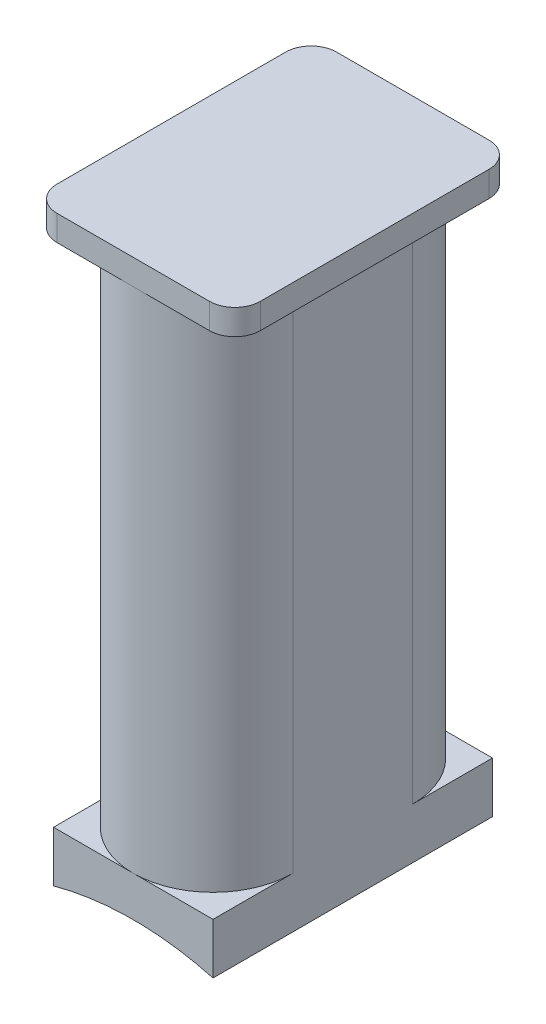
ISO-10303-21;
HEADER;
FILE_DESCRIPTION(('STEP AP214'),'2;1');
FILE_NAME('part.step','',(''),(''),'','','');
FILE_SCHEMA(('AUTOMOTIVE_DESIGN { 1 0 10303 214 1 1 1 1 }'));
ENDSEC;
DATA;
#1=APPLICATION_CONTEXT('core data for automotive mechanical design processes');
#2=APPLICATION_PROTOCOL_DEFINITION('international standard','automotive_design',2000,#1);
#3=PRODUCT_CONTEXT('',#1,'mechanical');
#4=PRODUCT('Part','Part','',(#3));
#5=PRODUCT_RELATED_PRODUCT_CATEGORY('part','',(#4));
#6=PRODUCT_DEFINITION_FORMATION('','',#4);
#7=PRODUCT_DEFINITION_CONTEXT('part definition',#1,'design');
#8=PRODUCT_DEFINITION('design','',#6,#7);
#9=PRODUCT_DEFINITION_SHAPE('','',#8);
#10=(LENGTH_UNIT() NAMED_UNIT(*) SI_UNIT(.MILLI.,.METRE.));
#11=(NAMED_UNIT(*) PLANE_ANGLE_UNIT() SI_UNIT($,.RADIAN.));
#12=(NAMED_UNIT(*) SI_UNIT($,.STERADIAN.) SOLID_ANGLE_UNIT());
#13=UNCERTAINTY_MEASURE_WITH_UNIT(LENGTH_MEASURE(1.E-05),#10,'distance_accuracy_value','');
#14=(GEOMETRIC_REPRESENTATION_CONTEXT(3) GLOBAL_UNCERTAINTY_ASSIGNED_CONTEXT((#13)) GLOBAL_UNIT_ASSIGNED_CONTEXT((#10,
#11,#12)) REPRESENTATION_CONTEXT('',''));
#15=CARTESIAN_POINT('',(0.,0.,0.));
#16=DIRECTION('',(0.,0.,1.));
#17=DIRECTION('',(1.,0.,0.));
#18=AXIS2_PLACEMENT_3D('',#15,#16,#17);
#19=CARTESIAN_POINT('',(174.255949813369,165.455600212496,5.5));
#20=DIRECTION('',(0.,0.,-1.));
#21=DIRECTION('',(-1.,0.,0.));
#22=AXIS2_PLACEMENT_3D('',#19,#20,#21);
#23=PLANE('',#22);
#24=DIRECTION('',(0.,1.,0.));
#25=VECTOR('',#24,1.);
#26=CARTESIAN_POINT('',(172.755949813369,165.455600212496,5.5));
#27=LINE('',#26,#25);
#28=CARTESIAN_POINT('',(172.755949813369,164.955600212496,5.5));
#29=VERTEX_POINT('',#28);
#30=CARTESIAN_POINT('',(172.755949813369,165.455600212496,5.5));
#31=VERTEX_POINT('',#30);
#32=EDGE_CURVE('E142',#29,#31,#27,.T.);
#33=ORIENTED_EDGE('',*,*,#32,.F.);
#34=DIRECTION('',(-1.,0.,0.));
#35=VECTOR('',#34,1.);
#36=CARTESIAN_POINT('',(174.255949813369,164.955600212496,5.5));
#37=LINE('',#36,#35);
#38=CARTESIAN_POINT('',(174.255949813369,164.955600212496,5.5));
#39=VERTEX_POINT('',#38);
#40=EDGE_CURVE('E248',#39,#29,#37,.T.);
#41=ORIENTED_EDGE('',*,*,#40,.F.);
#42=DIRECTION('',(-1.,0.,0.));
#43=VECTOR('',#42,1.);
#44=CARTESIAN_POINT('',(174.255949813369,164.955600212496,5.5));
#45=LINE('',#44,#43);
#46=CARTESIAN_POINT('',(175.755949813369,164.955600212496,5.5));
#47=VERTEX_POINT('',#46);
#48=EDGE_CURVE('E251',#47,#39,#45,.T.);
#49=ORIENTED_EDGE('',*,*,#48,.F.);
#50=DIRECTION('',(0.,1.,0.));
#51=VECTOR('',#50,1.);
#52=CARTESIAN_POINT('',(175.755949813369,165.455600212496,5.5));
#53=LINE('',#52,#51);
#54=CARTESIAN_POINT('',(175.755949813369,165.455600212496,5.5));
#55=VERTEX_POINT('',#54);
#56=EDGE_CURVE('E249',#55,#47,#53,.F.);
#57=ORIENTED_EDGE('',*,*,#56,.F.);
#58=DIRECTION('',(1.,0.,0.));
#59=VECTOR('',#58,1.);
#60=CARTESIAN_POINT('',(0.,165.455600212496,5.5));
#61=LINE('',#60,#59);
#62=EDGE_CURVE('E146',#31,#55,#61,.T.);
#63=ORIENTED_EDGE('',*,*,#62,.F.);
#64=EDGE_LOOP('',(#33,#41,#49,#57,#63));
#65=FACE_BOUND('',#64,.T.);
#66=ADVANCED_FACE('F17',(#65),#23,.F.);
#67=CARTESIAN_POINT('',(174.255949813369,165.455600212496,0.));
#68=DIRECTION('',(0.,0.,1.));
#69=DIRECTION('',(1.,0.,0.));
#70=AXIS2_PLACEMENT_3D('',#67,#68,#69);
#71=PLANE('',#70);
#72=DIRECTION('',(0.,1.,0.));
#73=VECTOR('',#72,1.);
#74=CARTESIAN_POINT('',(172.755949813369,165.455600212496,0.));
#75=LINE('',#74,#73);
#76=CARTESIAN_POINT('',(172.755949813369,165.455600212496,0.));
#77=VERTEX_POINT('',#76);
#78=CARTESIAN_POINT('',(172.755949813369,164.955600212496,0.));
#79=VERTEX_POINT('',#78);
#80=EDGE_CURVE('E244',#77,#79,#75,.F.);
#81=ORIENTED_EDGE('',*,*,#80,.F.);
#82=DIRECTION('',(1.,0.,0.));
#83=VECTOR('',#82,1.);
#84=CARTESIAN_POINT('',(0.,165.455600212496,0.));
#85=LINE('',#84,#83);
#86=CARTESIAN_POINT('',(175.755949813369,165.455600212496,0.));
#87=VERTEX_POINT('',#86);
#88=EDGE_CURVE('E229',#87,#77,#85,.F.);
#89=ORIENTED_EDGE('',*,*,#88,.F.);
#90=DIRECTION('',(0.,1.,0.));
#91=VECTOR('',#90,1.);
#92=CARTESIAN_POINT('',(175.755949813369,165.455600212496,0.));
#93=LINE('',#92,#91);
#94=CARTESIAN_POINT('',(175.755949813369,164.955600212496,0.));
#95=VERTEX_POINT('',#94);
#96=EDGE_CURVE('E242',#95,#87,#93,.T.);
#97=ORIENTED_EDGE('',*,*,#96,.F.);
#98=DIRECTION('',(1.,0.,0.));
#99=VECTOR('',#98,1.);
#100=CARTESIAN_POINT('',(174.255949813369,164.955600212496,0.));
#101=LINE('',#100,#99);
#102=CARTESIAN_POINT('',(174.255949813369,164.955600212496,0.));
#103=VERTEX_POINT('',#102);
#104=EDGE_CURVE('E245',#103,#95,#101,.T.);
#105=ORIENTED_EDGE('',*,*,#104,.F.);
#106=DIRECTION('',(1.,0.,0.));
#107=VECTOR('',#106,1.);
#108=CARTESIAN_POINT('',(174.255949813369,164.955600212496,0.));
#109=LINE('',#108,#107);
#110=EDGE_CURVE('E147',#79,#103,#109,.T.);
#111=ORIENTED_EDGE('',*,*,#110,.F.);
#112=EDGE_LOOP('',(#81,#89,#97,#105,#111));
#113=FACE_BOUND('',#112,.T.);
#114=ADVANCED_FACE('F379',(#113),#71,.F.);
#115=CARTESIAN_POINT('',(0.,165.455600212496,0.));
#116=DIRECTION('',(0.,1.,0.));
#117=DIRECTION('',(0.,0.,1.));
#118=AXIS2_PLACEMENT_3D('',#115,#116,#117);
#119=PLANE('',#118);
#120=ORIENTED_EDGE('',*,*,#88,.T.);
#121=CARTESIAN_POINT('',(172.755949813369,165.455600212496,0.5));
#122=DIRECTION('',(0.,1.,0.));
#123=DIRECTION('',(0.,0.,1.));
#124=AXIS2_PLACEMENT_3D('',#121,#122,#123);
#125=CIRCLE('',#124,0.5);
#126=CARTESIAN_POINT('',(172.255949813369,165.455600212496,0.5));
#127=VERTEX_POINT('',#126);
#128=EDGE_CURVE('E153',#127,#77,#125,.F.);
#129=ORIENTED_EDGE('',*,*,#128,.F.);
#130=DIRECTION('',(0.,0.,-1.));
#131=VECTOR('',#130,1.);
#132=CARTESIAN_POINT('',(172.255949813369,165.455600212496,0.));
#133=LINE('',#132,#131);
#134=CARTESIAN_POINT('',(172.255949813369,165.455600212496,5.));
#135=VERTEX_POINT('',#134);
#136=EDGE_CURVE('E149',#127,#135,#133,.F.);
#137=ORIENTED_EDGE('',*,*,#136,.T.);
#138=CARTESIAN_POINT('',(172.755949813369,165.455600212496,5.));
#139=DIRECTION('',(0.,1.,0.));
#140=DIRECTION('',(0.,0.,1.));
#141=AXIS2_PLACEMENT_3D('',#138,#139,#140);
#142=CIRCLE('',#141,0.5);
#143=EDGE_CURVE('E20',#135,#31,#142,.T.);
#144=ORIENTED_EDGE('',*,*,#143,.T.);
#145=ORIENTED_EDGE('',*,*,#62,.T.);
#146=CARTESIAN_POINT('',(175.755949813369,165.455600212496,5.));
#147=DIRECTION('',(0.,1.,0.));
#148=DIRECTION('',(0.,0.,1.));
#149=AXIS2_PLACEMENT_3D('',#146,#147,#148);
#150=CIRCLE('',#149,0.5);
#151=CARTESIAN_POINT('',(176.255949813369,165.455600212496,5.));
#152=VERTEX_POINT('',#151);
#153=EDGE_CURVE('E180',#152,#55,#150,.F.);
#154=ORIENTED_EDGE('',*,*,#153,.F.);
#155=DIRECTION('',(0.,0.,1.));
#156=VECTOR('',#155,1.);
#157=CARTESIAN_POINT('',(176.255949813369,165.455600212496,5.5));
#158=LINE('',#157,#156);
#159=CARTESIAN_POINT('',(176.255949813369,165.455600212496,0.5));
#160=VERTEX_POINT('',#159);
#161=EDGE_CURVE('E179',#152,#160,#158,.F.);
#162=ORIENTED_EDGE('',*,*,#161,.T.);
#163=CARTESIAN_POINT('',(175.755949813369,165.455600212496,0.5));
#164=DIRECTION('',(0.,1.,0.));
#165=DIRECTION('',(0.,0.,1.));
#166=AXIS2_PLACEMENT_3D('',#163,#164,#165);
#167=CIRCLE('',#166,0.5);
#168=EDGE_CURVE('E175',#87,#160,#167,.F.);
#169=ORIENTED_EDGE('',*,*,#168,.F.);
#170=EDGE_LOOP('',(#120,#129,#137,#144,#145,#154,#162,#169));
#171=FACE_BOUND('',#170,.T.);
#172=ADVANCED_FACE('F151',(#171),#119,.T.);
#173=CARTESIAN_POINT('',(174.255949813369,148.16465037676,5.5));
#174=DIRECTION('',(0.,0.,-1.));
#175=DIRECTION('',(-1.,0.,0.));
#176=AXIS2_PLACEMENT_3D('',#173,#174,#175);
#177=PLANE('',#176);
#178=DIRECTION('',(-1.,0.,0.));
#179=VECTOR('',#178,1.);
#180=CARTESIAN_POINT('',(174.255949813369,154.955600212495,5.5));
#181=LINE('',#180,#179);
#182=CARTESIAN_POINT('',(172.685949813369,154.955600212495,5.5));
#183=VERTEX_POINT('',#182);
#184=CARTESIAN_POINT('',(174.255949813369,154.955600212495,5.5));
#185=VERTEX_POINT('',#184);
#186=EDGE_CURVE('E224',#183,#185,#181,.F.);
#187=ORIENTED_EDGE('',*,*,#186,.F.);
#188=DIRECTION('',(0.,1.,0.));
#189=VECTOR('',#188,1.);
#190=CARTESIAN_POINT('',(172.685949813369,148.16465037676,5.5));
#191=LINE('',#190,#189);
#192=CARTESIAN_POINT('',(172.685949813369,153.955600212495,5.5));
#193=VERTEX_POINT('',#192);
#194=EDGE_CURVE('E221',#193,#183,#191,.T.);
#195=ORIENTED_EDGE('',*,*,#194,.F.);
#196=CARTESIAN_POINT('',(174.255949813369,148.16465037676,5.5));
#197=DIRECTION('',(0.,0.,1.));
#198=DIRECTION('',(1.,0.,0.));
#199=AXIS2_PLACEMENT_3D('',#196,#197,#198);
#200=CIRCLE('',#199,6.);
#201=CARTESIAN_POINT('',(175.825949813368,153.955600212495,5.5));
#202=VERTEX_POINT('',#201);
#203=EDGE_CURVE('E162',#193,#202,#200,.F.);
#204=ORIENTED_EDGE('',*,*,#203,.T.);
#205=DIRECTION('',(0.,1.,0.));
#206=VECTOR('',#205,1.);
#207=CARTESIAN_POINT('',(175.825949813368,148.16465037676,5.5));
#208=LINE('',#207,#206);
#209=CARTESIAN_POINT('',(175.825949813368,154.955600212495,5.5));
#210=VERTEX_POINT('',#209);
#211=EDGE_CURVE('E225',#210,#202,#208,.F.);
#212=ORIENTED_EDGE('',*,*,#211,.F.);
#213=DIRECTION('',(-1.,0.,0.));
#214=VECTOR('',#213,1.);
#215=CARTESIAN_POINT('',(174.255949813369,154.955600212495,5.5));
#216=LINE('',#215,#214);
#217=EDGE_CURVE('E211',#185,#210,#216,.F.);
#218=ORIENTED_EDGE('',*,*,#217,.F.);
#219=EDGE_LOOP('',(#187,#195,#204,#212,#218));
#220=FACE_BOUND('',#219,.T.);
#221=ADVANCED_FACE('F342',(#220),#177,.F.);
#222=CARTESIAN_POINT('',(174.255949813369,148.16465037676,0.));
#223=DIRECTION('',(0.,0.,-1.));
#224=DIRECTION('',(-1.,0.,0.));
#225=AXIS2_PLACEMENT_3D('',#222,#223,#224);
#226=PLANE('',#225);
#227=DIRECTION('',(0.,1.,0.));
#228=VECTOR('',#227,1.);
#229=CARTESIAN_POINT('',(172.685949813369,148.16465037676,0.));
#230=LINE('',#229,#228);
#231=CARTESIAN_POINT('',(172.685949813369,153.955600212495,0.));
#232=VERTEX_POINT('',#231);
#233=CARTESIAN_POINT('',(172.685949813369,154.955600212495,0.));
#234=VERTEX_POINT('',#233);
#235=EDGE_CURVE('E202',#232,#234,#230,.T.);
#236=ORIENTED_EDGE('',*,*,#235,.T.);
#237=DIRECTION('',(1.,0.,0.));
#238=VECTOR('',#237,1.);
#239=CARTESIAN_POINT('',(175.825949813368,154.955600212495,0.));
#240=LINE('',#239,#238);
#241=CARTESIAN_POINT('',(174.255949813369,154.955600212495,0.));
#242=VERTEX_POINT('',#241);
#243=EDGE_CURVE('E186',#234,#242,#240,.T.);
#244=ORIENTED_EDGE('',*,*,#243,.T.);
#245=DIRECTION('',(1.,0.,0.));
#246=VECTOR('',#245,1.);
#247=CARTESIAN_POINT('',(175.825949813368,154.955600212495,0.));
#248=LINE('',#247,#246);
#249=CARTESIAN_POINT('',(175.825949813368,154.955600212495,0.));
#250=VERTEX_POINT('',#249);
#251=EDGE_CURVE('E197',#242,#250,#248,.T.);
#252=ORIENTED_EDGE('',*,*,#251,.T.);
#253=DIRECTION('',(0.,1.,0.));
#254=VECTOR('',#253,1.);
#255=CARTESIAN_POINT('',(175.825949813368,148.16465037676,0.));
#256=LINE('',#255,#254);
#257=CARTESIAN_POINT('',(175.825949813368,153.955600212495,0.));
#258=VERTEX_POINT('',#257);
#259=EDGE_CURVE('E207',#250,#258,#256,.F.);
#260=ORIENTED_EDGE('',*,*,#259,.T.);
#261=CARTESIAN_POINT('',(174.255949813369,148.16465037676,0.));
#262=DIRECTION('',(0.,0.,1.));
#263=DIRECTION('',(1.,0.,0.));
#264=AXIS2_PLACEMENT_3D('',#261,#262,#263);
#265=CIRCLE('',#264,6.);
#266=EDGE_CURVE('E165',#258,#232,#265,.T.);
#267=ORIENTED_EDGE('',*,*,#266,.T.);
#268=EDGE_LOOP('',(#236,#244,#252,#260,#267));
#269=FACE_BOUND('',#268,.T.);
#270=ADVANCED_FACE('F321',(#269),#226,.T.);
#271=CARTESIAN_POINT('',(175.825949813368,154.955600212495,5.5));
#272=DIRECTION('',(0.,-1.,0.));
#273=DIRECTION('',(0.,0.,-1.));
#274=AXIS2_PLACEMENT_3D('',#271,#272,#273);
#275=PLANE('',#274);
#276=DIRECTION('',(0.,0.,-1.));
#277=VECTOR('',#276,1.);
#278=CARTESIAN_POINT('',(175.825949813368,154.955600212495,5.5));
#279=LINE('',#278,#277);
#280=CARTESIAN_POINT('',(175.825949813368,154.955600212495,1.57));
#281=VERTEX_POINT('',#280);
#282=EDGE_CURVE('E193',#250,#281,#279,.F.);
#283=ORIENTED_EDGE('',*,*,#282,.F.);
#284=ORIENTED_EDGE('',*,*,#251,.F.);
#285=CARTESIAN_POINT('',(174.255949813369,154.955600212495,1.57));
#286=DIRECTION('',(0.,1.,0.));
#287=DIRECTION('',(0.,0.,1.));
#288=AXIS2_PLACEMENT_3D('',#285,#286,#287);
#289=CIRCLE('',#288,1.57);
#290=EDGE_CURVE('E286',#281,#242,#289,.T.);
#291=ORIENTED_EDGE('',*,*,#290,.F.);
#292=EDGE_LOOP('',(#283,#284,#291));
#293=FACE_BOUND('',#292,.T.);
#294=ADVANCED_FACE('F331',(#293),#275,.F.);
#295=CARTESIAN_POINT('',(175.825949813368,154.955600212495,5.5));
#296=DIRECTION('',(0.,-1.,0.));
#297=DIRECTION('',(0.,0.,-1.));
#298=AXIS2_PLACEMENT_3D('',#295,#296,#297);
#299=PLANE('',#298);
#300=ORIENTED_EDGE('',*,*,#243,.F.);
#301=DIRECTION('',(0.,0.,-1.));
#302=VECTOR('',#301,1.);
#303=CARTESIAN_POINT('',(172.685949813369,154.955600212495,5.5));
#304=LINE('',#303,#302);
#305=CARTESIAN_POINT('',(172.685949813369,154.955600212495,1.57));
#306=VERTEX_POINT('',#305);
#307=EDGE_CURVE('E188',#306,#234,#304,.T.);
#308=ORIENTED_EDGE('',*,*,#307,.F.);
#309=CARTESIAN_POINT('',(174.255949813369,154.955600212495,1.57));
#310=DIRECTION('',(0.,1.,0.));
#311=DIRECTION('',(0.,0.,1.));
#312=AXIS2_PLACEMENT_3D('',#309,#310,#311);
#313=CIRCLE('',#312,1.57);
#314=EDGE_CURVE('E185',#242,#306,#313,.T.);
#315=ORIENTED_EDGE('',*,*,#314,.F.);
#316=EDGE_LOOP('',(#300,#308,#315));
#317=FACE_BOUND('',#316,.T.);
#318=ADVANCED_FACE('F324',(#317),#299,.F.);
#319=CARTESIAN_POINT('',(175.755949813369,165.455600212496,5.));
#320=DIRECTION('',(0.,1.,0.));
#321=DIRECTION('',(0.,0.,1.));
#322=AXIS2_PLACEMENT_3D('',#319,#320,#321);
#323=CYLINDRICAL_SURFACE('',#322,0.5);
#324=CARTESIAN_POINT('',(175.755949813369,164.955600212496,5.));
#325=DIRECTION('',(0.,1.,0.));
#326=DIRECTION('',(0.,0.,1.));
#327=AXIS2_PLACEMENT_3D('',#324,#325,#326);
#328=CIRCLE('',#327,0.5);
#329=CARTESIAN_POINT('',(176.255949813369,164.955600212496,5.));
#330=VERTEX_POINT('',#329);
#331=EDGE_CURVE('E279',#47,#330,#328,.T.);
#332=ORIENTED_EDGE('',*,*,#331,.T.);
#333=DIRECTION('',(0.,1.,0.));
#334=VECTOR('',#333,1.);
#335=CARTESIAN_POINT('',(176.255949813369,165.455600212496,5.));
#336=LINE('',#335,#334);
#337=EDGE_CURVE('E176',#330,#152,#336,.T.);
#338=ORIENTED_EDGE('',*,*,#337,.T.);
#339=ORIENTED_EDGE('',*,*,#153,.T.);
#340=ORIENTED_EDGE('',*,*,#56,.T.);
#341=EDGE_LOOP('',(#332,#338,#339,#340));
#342=FACE_BOUND('',#341,.T.);
#343=ADVANCED_FACE('F295',(#342),#323,.T.);
#344=CARTESIAN_POINT('',(176.255949813369,165.455600212496,5.5));
#345=DIRECTION('',(-1.,0.,0.));
#346=DIRECTION('',(0.,0.,1.));
#347=AXIS2_PLACEMENT_3D('',#344,#345,#346);
#348=PLANE('',#347);
#349=DIRECTION('',(0.,1.,0.));
#350=VECTOR('',#349,1.);
#351=CARTESIAN_POINT('',(176.255949813369,165.455600212496,0.5));
#352=LINE('',#351,#350);
#353=CARTESIAN_POINT('',(176.255949813369,164.955600212496,0.5));
#354=VERTEX_POINT('',#353);
#355=EDGE_CURVE('E172',#160,#354,#352,.F.);
#356=ORIENTED_EDGE('',*,*,#355,.F.);
#357=ORIENTED_EDGE('',*,*,#161,.F.);
#358=ORIENTED_EDGE('',*,*,#337,.F.);
#359=DIRECTION('',(0.,0.,1.));
#360=VECTOR('',#359,1.);
#361=CARTESIAN_POINT('',(176.255949813369,164.955600212496,0.));
#362=LINE('',#361,#360);
#363=EDGE_CURVE('E278',#330,#354,#362,.F.);
#364=ORIENTED_EDGE('',*,*,#363,.T.);
#365=EDGE_LOOP('',(#356,#357,#358,#364));
#366=FACE_BOUND('',#365,.T.);
#367=ADVANCED_FACE('F371',(#366),#348,.F.);
#368=CARTESIAN_POINT('',(175.755949813369,165.455600212496,0.5));
#369=DIRECTION('',(0.,1.,0.));
#370=DIRECTION('',(0.,0.,1.));
#371=AXIS2_PLACEMENT_3D('',#368,#369,#370);
#372=CYLINDRICAL_SURFACE('',#371,0.5);
#373=CARTESIAN_POINT('',(175.755949813369,164.955600212496,0.5));
#374=DIRECTION('',(0.,1.,0.));
#375=DIRECTION('',(0.,0.,1.));
#376=AXIS2_PLACEMENT_3D('',#373,#374,#375);
#377=CIRCLE('',#376,0.5);
#378=EDGE_CURVE('E275',#354,#95,#377,.T.);
#379=ORIENTED_EDGE('',*,*,#378,.T.);
#380=ORIENTED_EDGE('',*,*,#96,.T.);
#381=ORIENTED_EDGE('',*,*,#168,.T.);
#382=ORIENTED_EDGE('',*,*,#355,.T.);
#383=EDGE_LOOP('',(#379,#380,#381,#382));
#384=FACE_BOUND('',#383,.T.);
#385=ADVANCED_FACE('F373',(#384),#372,.T.);
#386=CARTESIAN_POINT('',(172.755949813369,165.455600212496,0.5));
#387=DIRECTION('',(0.,1.,0.));
#388=DIRECTION('',(0.,0.,1.));
#389=AXIS2_PLACEMENT_3D('',#386,#387,#388);
#390=CYLINDRICAL_SURFACE('',#389,0.5);
#391=CARTESIAN_POINT('',(172.755949813369,164.955600212496,0.5));
#392=DIRECTION('',(0.,1.,0.));
#393=DIRECTION('',(0.,0.,1.));
#394=AXIS2_PLACEMENT_3D('',#391,#392,#393);
#395=CIRCLE('',#394,0.5);
#396=CARTESIAN_POINT('',(172.255949813369,164.955600212496,0.5));
#397=VERTEX_POINT('',#396);
#398=EDGE_CURVE('E270',#79,#397,#395,.T.);
#399=ORIENTED_EDGE('',*,*,#398,.T.);
#400=DIRECTION('',(0.,1.,0.));
#401=VECTOR('',#400,1.);
#402=CARTESIAN_POINT('',(172.255949813369,165.455600212496,0.5));
#403=LINE('',#402,#401);
#404=EDGE_CURVE('E157',#397,#127,#403,.T.);
#405=ORIENTED_EDGE('',*,*,#404,.T.);
#406=ORIENTED_EDGE('',*,*,#128,.T.);
#407=ORIENTED_EDGE('',*,*,#80,.T.);
#408=EDGE_LOOP('',(#399,#405,#406,#407));
#409=FACE_BOUND('',#408,.T.);
#410=ADVANCED_FACE('F378',(#409),#390,.T.);
#411=CARTESIAN_POINT('',(172.255949813369,165.455600212496,0.));
#412=DIRECTION('',(1.,0.,0.));
#413=DIRECTION('',(0.,0.,-1.));
#414=AXIS2_PLACEMENT_3D('',#411,#412,#413);
#415=PLANE('',#414);
#416=DIRECTION('',(0.,1.,0.));
#417=VECTOR('',#416,1.);
#418=CARTESIAN_POINT('',(172.255949813369,165.455600212496,5.));
#419=LINE('',#418,#417);
#420=CARTESIAN_POINT('',(172.255949813369,164.955600212496,5.));
#421=VERTEX_POINT('',#420);
#422=EDGE_CURVE('E139',#135,#421,#419,.F.);
#423=ORIENTED_EDGE('',*,*,#422,.F.);
#424=ORIENTED_EDGE('',*,*,#136,.F.);
#425=ORIENTED_EDGE('',*,*,#404,.F.);
#426=DIRECTION('',(0.,0.,1.));
#427=VECTOR('',#426,1.);
#428=CARTESIAN_POINT('',(172.255949813369,164.955600212496,0.));
#429=LINE('',#428,#427);
#430=EDGE_CURVE('E161',#397,#421,#429,.T.);
#431=ORIENTED_EDGE('',*,*,#430,.T.);
#432=EDGE_LOOP('',(#423,#424,#425,#431));
#433=FACE_BOUND('',#432,.T.);
#434=ADVANCED_FACE('F159',(#433),#415,.F.);
#435=CARTESIAN_POINT('',(172.755949813369,165.455600212496,5.));
#436=DIRECTION('',(0.,1.,0.));
#437=DIRECTION('',(0.,0.,1.));
#438=AXIS2_PLACEMENT_3D('',#435,#436,#437);
#439=CYLINDRICAL_SURFACE('',#438,0.5);
#440=CARTESIAN_POINT('',(172.755949813369,164.955600212496,5.));
#441=DIRECTION('',(0.,1.,0.));
#442=DIRECTION('',(0.,0.,1.));
#443=AXIS2_PLACEMENT_3D('',#440,#441,#442);
#444=CIRCLE('',#443,0.5);
#445=EDGE_CURVE('E268',#421,#29,#444,.T.);
#446=ORIENTED_EDGE('',*,*,#445,.T.);
#447=ORIENTED_EDGE('',*,*,#32,.T.);
#448=ORIENTED_EDGE('',*,*,#143,.F.);
#449=ORIENTED_EDGE('',*,*,#422,.T.);
#450=EDGE_LOOP('',(#446,#447,#448,#449));
#451=FACE_BOUND('',#450,.T.);
#452=ADVANCED_FACE('F137',(#451),#439,.T.);
#453=CARTESIAN_POINT('',(174.255949813369,148.16465037676,5.5));
#454=DIRECTION('',(0.,0.,1.));
#455=DIRECTION('',(1.,0.,0.));
#456=AXIS2_PLACEMENT_3D('',#453,#454,#455);
#457=CYLINDRICAL_SURFACE('',#456,6.);
#458=DIRECTION('',(0.,0.,1.));
#459=VECTOR('',#458,1.);
#460=CARTESIAN_POINT('',(175.825949813368,153.955600212495,5.5));
#461=LINE('',#460,#459);
#462=EDGE_CURVE('E184',#258,#202,#461,.T.);
#463=ORIENTED_EDGE('',*,*,#462,.T.);
#464=ORIENTED_EDGE('',*,*,#203,.F.);
#465=DIRECTION('',(0.,0.,-1.));
#466=VECTOR('',#465,1.);
#467=CARTESIAN_POINT('',(172.685949813369,153.955600212495,5.5));
#468=LINE('',#467,#466);
#469=EDGE_CURVE('E217',#193,#232,#468,.T.);
#470=ORIENTED_EDGE('',*,*,#469,.T.);
#471=ORIENTED_EDGE('',*,*,#266,.F.);
#472=EDGE_LOOP('',(#463,#464,#470,#471));
#473=FACE_BOUND('',#472,.T.);
#474=ADVANCED_FACE('F335',(#473),#457,.F.);
#475=CARTESIAN_POINT('',(174.255949813369,162.955600212496,1.57));
#476=DIRECTION('',(0.,1.,0.));
#477=DIRECTION('',(0.,0.,1.));
#478=AXIS2_PLACEMENT_3D('',#475,#476,#477);
#479=CYLINDRICAL_SURFACE('',#478,1.57);
#480=CARTESIAN_POINT('',(174.255949813369,164.955600212496,1.57));
#481=DIRECTION('',(0.,1.,0.));
#482=DIRECTION('',(0.,0.,1.));
#483=AXIS2_PLACEMENT_3D('',#480,#481,#482);
#484=CIRCLE('',#483,1.57);
#485=CARTESIAN_POINT('',(175.825949813368,164.955600212496,1.57));
#486=VERTEX_POINT('',#485);
#487=EDGE_CURVE('E282',#103,#486,#484,.F.);
#488=ORIENTED_EDGE('',*,*,#487,.T.);
#489=DIRECTION('',(0.,1.,0.));
#490=VECTOR('',#489,1.);
#491=CARTESIAN_POINT('',(175.825949813368,153.955600212495,1.57));
#492=LINE('',#491,#490);
#493=EDGE_CURVE('E181',#486,#281,#492,.F.);
#494=ORIENTED_EDGE('',*,*,#493,.T.);
#495=ORIENTED_EDGE('',*,*,#290,.T.);
#496=ORIENTED_EDGE('',*,*,#314,.T.);
#497=DIRECTION('',(0.,1.,0.));
#498=VECTOR('',#497,1.);
#499=CARTESIAN_POINT('',(172.685949813369,154.955600212495,1.57));
#500=LINE('',#499,#498);
#501=CARTESIAN_POINT('',(172.685949813369,164.955600212496,1.57));
#502=VERTEX_POINT('',#501);
#503=EDGE_CURVE('E169',#306,#502,#500,.T.);
#504=ORIENTED_EDGE('',*,*,#503,.T.);
#505=CARTESIAN_POINT('',(174.255949813369,164.955600212496,1.57));
#506=DIRECTION('',(0.,1.,0.));
#507=DIRECTION('',(0.,0.,1.));
#508=AXIS2_PLACEMENT_3D('',#505,#506,#507);
#509=CIRCLE('',#508,1.57);
#510=EDGE_CURVE('E272',#502,#103,#509,.F.);
#511=ORIENTED_EDGE('',*,*,#510,.T.);
#512=EDGE_LOOP('',(#488,#494,#495,#496,#504,#511));
#513=FACE_BOUND('',#512,.T.);
#514=ADVANCED_FACE('F327',(#513),#479,.T.);
#515=CARTESIAN_POINT('',(175.825949813368,154.955600212495,5.5));
#516=DIRECTION('',(0.,-1.,0.));
#517=DIRECTION('',(0.,0.,-1.));
#518=AXIS2_PLACEMENT_3D('',#515,#516,#517);
#519=PLANE('',#518);
#520=DIRECTION('',(0.,0.,-1.));
#521=VECTOR('',#520,1.);
#522=CARTESIAN_POINT('',(172.685949813369,154.955600212495,5.5));
#523=LINE('',#522,#521);
#524=CARTESIAN_POINT('',(172.685949813369,154.955600212495,3.93));
#525=VERTEX_POINT('',#524);
#526=EDGE_CURVE('E220',#525,#183,#523,.F.);
#527=ORIENTED_EDGE('',*,*,#526,.T.);
#528=ORIENTED_EDGE('',*,*,#186,.T.);
#529=CARTESIAN_POINT('',(174.255949813369,154.955600212495,3.93));
#530=DIRECTION('',(0.,1.,0.));
#531=DIRECTION('',(0.,0.,1.));
#532=AXIS2_PLACEMENT_3D('',#529,#530,#531);
#533=CIRCLE('',#532,1.57);
#534=EDGE_CURVE('E265',#525,#185,#533,.T.);
#535=ORIENTED_EDGE('',*,*,#534,.F.);
#536=EDGE_LOOP('',(#527,#528,#535));
#537=FACE_BOUND('',#536,.T.);
#538=ADVANCED_FACE('F344',(#537),#519,.F.);
#539=CARTESIAN_POINT('',(175.825949813368,154.955600212495,5.5));
#540=DIRECTION('',(0.,-1.,0.));
#541=DIRECTION('',(0.,0.,-1.));
#542=AXIS2_PLACEMENT_3D('',#539,#540,#541);
#543=PLANE('',#542);
#544=ORIENTED_EDGE('',*,*,#217,.T.);
#545=DIRECTION('',(0.,0.,1.));
#546=VECTOR('',#545,1.);
#547=CARTESIAN_POINT('',(175.825949813368,154.955600212495,5.5));
#548=LINE('',#547,#546);
#549=CARTESIAN_POINT('',(175.825949813368,154.955600212495,3.93));
#550=VERTEX_POINT('',#549);
#551=EDGE_CURVE('E216',#210,#550,#548,.F.);
#552=ORIENTED_EDGE('',*,*,#551,.T.);
#553=CARTESIAN_POINT('',(174.255949813369,154.955600212495,3.93));
#554=DIRECTION('',(0.,1.,0.));
#555=DIRECTION('',(0.,0.,1.));
#556=AXIS2_PLACEMENT_3D('',#553,#554,#555);
#557=CIRCLE('',#556,1.57);
#558=EDGE_CURVE('E262',#185,#550,#557,.T.);
#559=ORIENTED_EDGE('',*,*,#558,.F.);
#560=EDGE_LOOP('',(#544,#552,#559));
#561=FACE_BOUND('',#560,.T.);
#562=ADVANCED_FACE('F348',(#561),#543,.F.);
#563=CARTESIAN_POINT('',(175.825949813368,153.955600212495,5.5));
#564=DIRECTION('',(-1.,0.,0.));
#565=DIRECTION('',(0.,0.,1.));
#566=AXIS2_PLACEMENT_3D('',#563,#564,#565);
#567=PLANE('',#566);
#568=DIRECTION('',(0.,1.,0.));
#569=VECTOR('',#568,1.);
#570=CARTESIAN_POINT('',(175.825949813369,162.955600212496,3.93));
#571=LINE('',#570,#569);
#572=CARTESIAN_POINT('',(175.825949813368,164.955600212496,3.93));
#573=VERTEX_POINT('',#572);
#574=EDGE_CURVE('E261',#550,#573,#571,.T.);
#575=ORIENTED_EDGE('',*,*,#574,.F.);
#576=ORIENTED_EDGE('',*,*,#551,.F.);
#577=ORIENTED_EDGE('',*,*,#211,.T.);
#578=ORIENTED_EDGE('',*,*,#462,.F.);
#579=ORIENTED_EDGE('',*,*,#259,.F.);
#580=ORIENTED_EDGE('',*,*,#282,.T.);
#581=ORIENTED_EDGE('',*,*,#493,.F.);
#582=DIRECTION('',(0.,0.,1.));
#583=VECTOR('',#582,1.);
#584=CARTESIAN_POINT('',(175.825949813368,164.955600212496,0.));
#585=LINE('',#584,#583);
#586=EDGE_CURVE('E281',#486,#573,#585,.T.);
#587=ORIENTED_EDGE('',*,*,#586,.T.);
#588=EDGE_LOOP('',(#575,#576,#577,#578,#579,#580,#581,#587));
#589=FACE_BOUND('',#588,.T.);
#590=ADVANCED_FACE('F338',(#589),#567,.F.);
#591=CARTESIAN_POINT('',(0.,164.955600212496,0.));
#592=DIRECTION('',(0.,1.,0.));
#593=DIRECTION('',(0.,0.,1.));
#594=AXIS2_PLACEMENT_3D('',#591,#592,#593);
#595=PLANE('',#594);
#596=ORIENTED_EDGE('',*,*,#378,.F.);
#597=ORIENTED_EDGE('',*,*,#363,.F.);
#598=ORIENTED_EDGE('',*,*,#331,.F.);
#599=ORIENTED_EDGE('',*,*,#48,.T.);
#600=CARTESIAN_POINT('',(174.255949813369,164.955600212496,3.93));
#601=DIRECTION('',(0.,1.,0.));
#602=DIRECTION('',(0.,0.,1.));
#603=AXIS2_PLACEMENT_3D('',#600,#601,#602);
#604=CIRCLE('',#603,1.57);
#605=EDGE_CURVE('E258',#573,#39,#604,.F.);
#606=ORIENTED_EDGE('',*,*,#605,.F.);
#607=ORIENTED_EDGE('',*,*,#586,.F.);
#608=ORIENTED_EDGE('',*,*,#487,.F.);
#609=ORIENTED_EDGE('',*,*,#104,.T.);
#610=EDGE_LOOP('',(#596,#597,#598,#599,#606,#607,#608,#609));
#611=FACE_BOUND('',#610,.T.);
#612=ADVANCED_FACE('F368',(#611),#595,.F.);
#613=CARTESIAN_POINT('',(0.,164.955600212496,0.));
#614=DIRECTION('',(0.,1.,0.));
#615=DIRECTION('',(0.,0.,1.));
#616=AXIS2_PLACEMENT_3D('',#613,#614,#615);
#617=PLANE('',#616);
#618=ORIENTED_EDGE('',*,*,#445,.F.);
#619=ORIENTED_EDGE('',*,*,#430,.F.);
#620=ORIENTED_EDGE('',*,*,#398,.F.);
#621=ORIENTED_EDGE('',*,*,#110,.T.);
#622=ORIENTED_EDGE('',*,*,#510,.F.);
#623=DIRECTION('',(0.,0.,-1.));
#624=VECTOR('',#623,1.);
#625=CARTESIAN_POINT('',(172.685949813369,164.955600212496,5.5));
#626=LINE('',#625,#624);
#627=CARTESIAN_POINT('',(172.685949813369,164.955600212496,3.93));
#628=VERTEX_POINT('',#627);
#629=EDGE_CURVE('E35',#502,#628,#626,.F.);
#630=ORIENTED_EDGE('',*,*,#629,.T.);
#631=CARTESIAN_POINT('',(174.255949813369,164.955600212496,3.93));
#632=DIRECTION('',(0.,1.,0.));
#633=DIRECTION('',(0.,0.,1.));
#634=AXIS2_PLACEMENT_3D('',#631,#632,#633);
#635=CIRCLE('',#634,1.57);
#636=EDGE_CURVE('E26',#39,#628,#635,.F.);
#637=ORIENTED_EDGE('',*,*,#636,.F.);
#638=ORIENTED_EDGE('',*,*,#40,.T.);
#639=EDGE_LOOP('',(#618,#619,#620,#621,#622,#630,#637,#638));
#640=FACE_BOUND('',#639,.T.);
#641=ADVANCED_FACE('F362',(#640),#617,.F.);
#642=CARTESIAN_POINT('',(172.685949813369,154.955600212495,5.5));
#643=DIRECTION('',(1.,0.,0.));
#644=DIRECTION('',(0.,0.,-1.));
#645=AXIS2_PLACEMENT_3D('',#642,#643,#644);
#646=PLANE('',#645);
#647=ORIENTED_EDGE('',*,*,#503,.F.);
#648=ORIENTED_EDGE('',*,*,#307,.T.);
#649=ORIENTED_EDGE('',*,*,#235,.F.);
#650=ORIENTED_EDGE('',*,*,#469,.F.);
#651=ORIENTED_EDGE('',*,*,#194,.T.);
#652=ORIENTED_EDGE('',*,*,#526,.F.);
#653=DIRECTION('',(0.,1.,0.));
#654=VECTOR('',#653,1.);
#655=CARTESIAN_POINT('',(172.685949813369,162.955600212496,3.93));
#656=LINE('',#655,#654);
#657=EDGE_CURVE('E11',#628,#525,#656,.F.);
#658=ORIENTED_EDGE('',*,*,#657,.F.);
#659=ORIENTED_EDGE('',*,*,#629,.F.);
#660=EDGE_LOOP('',(#647,#648,#649,#650,#651,#652,#658,#659));
#661=FACE_BOUND('',#660,.T.);
#662=ADVANCED_FACE('F316',(#661),#646,.F.);
#663=CARTESIAN_POINT('',(174.255949813369,162.955600212496,3.93));
#664=DIRECTION('',(0.,1.,0.));
#665=DIRECTION('',(0.,0.,1.));
#666=AXIS2_PLACEMENT_3D('',#663,#664,#665);
#667=CYLINDRICAL_SURFACE('',#666,1.57);
#668=ORIENTED_EDGE('',*,*,#636,.T.);
#669=ORIENTED_EDGE('',*,*,#657,.T.);
#670=ORIENTED_EDGE('',*,*,#534,.T.);
#671=ORIENTED_EDGE('',*,*,#558,.T.);
#672=ORIENTED_EDGE('',*,*,#574,.T.);
#673=ORIENTED_EDGE('',*,*,#605,.T.);
#674=EDGE_LOOP('',(#668,#669,#670,#671,#672,#673));
#675=FACE_BOUND('',#674,.T.);
#676=ADVANCED_FACE('F346',(#675),#667,.T.);
#677=CLOSED_SHELL('',(#66,#114,#172,#221,#270,#294,#318,#343,#367,#385,#410,#434,#452,#474,#514,
#538,#562,#590,#612,#641,#662,#676));
#678=MANIFOLD_SOLID_BREP('B1',#677);
#679=ADVANCED_BREP_SHAPE_REPRESENTATION('',(#18,#678),#14);
#680=SHAPE_DEFINITION_REPRESENTATION(#9,#679);
ENDSEC;
END-ISO-10303-21;
